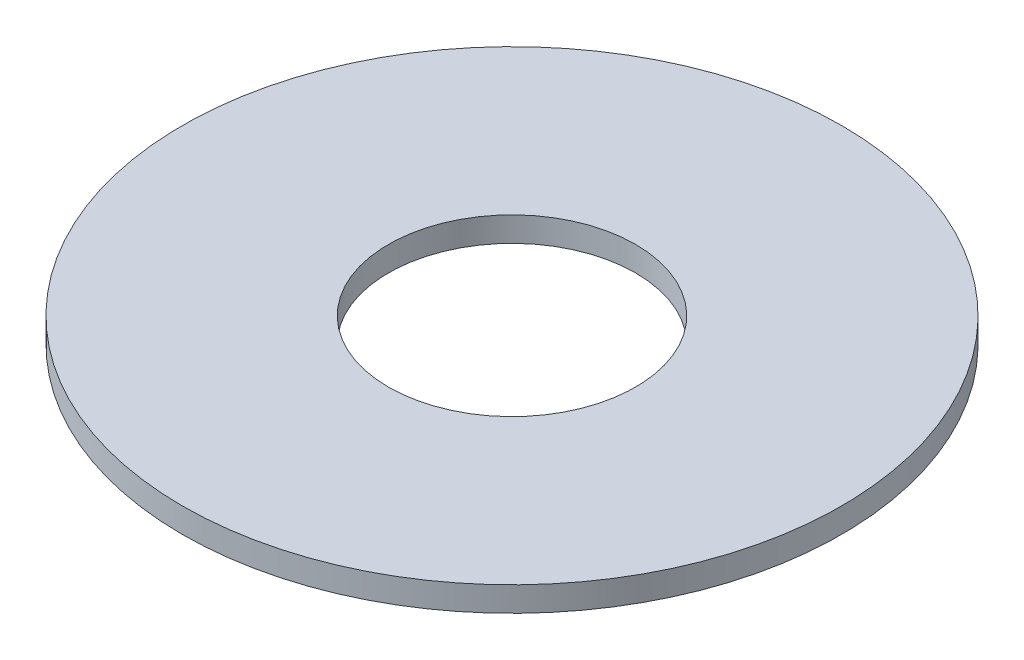
ISO-10303-21;
HEADER;
FILE_DESCRIPTION(('STEP AP214'),'2;1');
FILE_NAME('part.step','',(''),(''),'','','');
FILE_SCHEMA(('AUTOMOTIVE_DESIGN { 1 0 10303 214 1 1 1 1 }'));
ENDSEC;
DATA;
#1=APPLICATION_CONTEXT('core data for automotive mechanical design processes');
#2=APPLICATION_PROTOCOL_DEFINITION('international standard','automotive_design',2000,#1);
#3=PRODUCT_CONTEXT('',#1,'mechanical');
#4=PRODUCT('Part','Part','',(#3));
#5=PRODUCT_RELATED_PRODUCT_CATEGORY('part','',(#4));
#6=PRODUCT_DEFINITION_FORMATION('','',#4);
#7=PRODUCT_DEFINITION_CONTEXT('part definition',#1,'design');
#8=PRODUCT_DEFINITION('design','',#6,#7);
#9=PRODUCT_DEFINITION_SHAPE('','',#8);
#10=(LENGTH_UNIT() NAMED_UNIT(*) SI_UNIT(.MILLI.,.METRE.));
#11=(NAMED_UNIT(*) PLANE_ANGLE_UNIT() SI_UNIT($,.RADIAN.));
#12=(NAMED_UNIT(*) SI_UNIT($,.STERADIAN.) SOLID_ANGLE_UNIT());
#13=UNCERTAINTY_MEASURE_WITH_UNIT(LENGTH_MEASURE(1.E-05),#10,'distance_accuracy_value','');
#14=(GEOMETRIC_REPRESENTATION_CONTEXT(3) GLOBAL_UNCERTAINTY_ASSIGNED_CONTEXT((#13)) GLOBAL_UNIT_ASSIGNED_CONTEXT((#10,
#11,#12)) REPRESENTATION_CONTEXT('',''));
#15=CARTESIAN_POINT('',(0.,0.,0.));
#16=DIRECTION('',(0.,0.,1.));
#17=DIRECTION('',(1.,0.,0.));
#18=AXIS2_PLACEMENT_3D('',#15,#16,#17);
#19=CARTESIAN_POINT('',(0.,0.3,0.));
#20=DIRECTION('',(0.,1.,0.));
#21=DIRECTION('',(0.,0.,1.));
#22=AXIS2_PLACEMENT_3D('',#19,#20,#21);
#23=PLANE('',#22);
#24=CARTESIAN_POINT('',(0.,0.3,0.));
#25=DIRECTION('',(0.,1.,0.));
#26=DIRECTION('',(0.,0.,1.));
#27=AXIS2_PLACEMENT_3D('',#24,#25,#26);
#28=CIRCLE('',#27,4.);
#29=CARTESIAN_POINT('',(0.,0.3,4.));
#30=VERTEX_POINT('',#29);
#31=EDGE_CURVE('E10',#30,#30,#28,.T.);
#32=ORIENTED_EDGE('',*,*,#31,.T.);
#33=EDGE_LOOP('',(#32));
#34=FACE_BOUND('',#33,.T.);
#35=CARTESIAN_POINT('',(0.,0.3,0.));
#36=DIRECTION('',(0.,1.,0.));
#37=DIRECTION('',(0.,0.,1.));
#38=AXIS2_PLACEMENT_3D('',#35,#36,#37);
#39=CIRCLE('',#38,1.5);
#40=CARTESIAN_POINT('',(0.,0.3,1.5));
#41=VERTEX_POINT('',#40);
#42=EDGE_CURVE('E50',#41,#41,#39,.T.);
#43=ORIENTED_EDGE('',*,*,#42,.F.);
#44=EDGE_LOOP('',(#43));
#45=FACE_BOUND('',#44,.T.);
#46=ADVANCED_FACE('F39',(#34,#45),#23,.T.);
#47=CARTESIAN_POINT('',(0.,0.,0.));
#48=DIRECTION('',(0.,1.,0.));
#49=DIRECTION('',(0.,0.,1.));
#50=AXIS2_PLACEMENT_3D('',#47,#48,#49);
#51=PLANE('',#50);
#52=CARTESIAN_POINT('',(0.,0.,0.));
#53=DIRECTION('',(0.,1.,0.));
#54=DIRECTION('',(0.,0.,1.));
#55=AXIS2_PLACEMENT_3D('',#52,#53,#54);
#56=CIRCLE('',#55,4.);
#57=CARTESIAN_POINT('',(0.,0.,4.));
#58=VERTEX_POINT('',#57);
#59=EDGE_CURVE('E43',#58,#58,#56,.T.);
#60=ORIENTED_EDGE('',*,*,#59,.F.);
#61=EDGE_LOOP('',(#60));
#62=FACE_BOUND('',#61,.T.);
#63=CARTESIAN_POINT('',(0.,0.,0.));
#64=DIRECTION('',(0.,1.,0.));
#65=DIRECTION('',(0.,0.,1.));
#66=AXIS2_PLACEMENT_3D('',#63,#64,#65);
#67=CIRCLE('',#66,1.5);
#68=CARTESIAN_POINT('',(0.,0.,1.5));
#69=VERTEX_POINT('',#68);
#70=EDGE_CURVE('E52',#69,#69,#67,.T.);
#71=ORIENTED_EDGE('',*,*,#70,.T.);
#72=EDGE_LOOP('',(#71));
#73=FACE_BOUND('',#72,.T.);
#74=ADVANCED_FACE('F62',(#62,#73),#51,.F.);
#75=CARTESIAN_POINT('',(0.,0.3,0.));
#76=DIRECTION('',(0.,-1.,0.));
#77=DIRECTION('',(0.,0.,-1.));
#78=AXIS2_PLACEMENT_3D('',#75,#76,#77);
#79=CYLINDRICAL_SURFACE('',#78,4.);
#80=ORIENTED_EDGE('',*,*,#31,.F.);
#81=EDGE_LOOP('',(#80));
#82=FACE_BOUND('',#81,.T.);
#83=ORIENTED_EDGE('',*,*,#59,.T.);
#84=EDGE_LOOP('',(#83));
#85=FACE_BOUND('',#84,.T.);
#86=ADVANCED_FACE('F41',(#82,#85),#79,.T.);
#87=CARTESIAN_POINT('',(0.,0.3,0.));
#88=DIRECTION('',(0.,-1.,0.));
#89=DIRECTION('',(0.,0.,-1.));
#90=AXIS2_PLACEMENT_3D('',#87,#88,#89);
#91=CYLINDRICAL_SURFACE('',#90,1.5);
#92=ORIENTED_EDGE('',*,*,#42,.T.);
#93=EDGE_LOOP('',(#92));
#94=FACE_BOUND('',#93,.T.);
#95=ORIENTED_EDGE('',*,*,#70,.F.);
#96=EDGE_LOOP('',(#95));
#97=FACE_BOUND('',#96,.T.);
#98=ADVANCED_FACE('F58',(#94,#97),#91,.F.);
#99=CLOSED_SHELL('',(#46,#74,#86,#98));
#100=MANIFOLD_SOLID_BREP('B2',#99);
#101=ADVANCED_BREP_SHAPE_REPRESENTATION('',(#18,#100),#14);
#102=SHAPE_DEFINITION_REPRESENTATION(#9,#101);
ENDSEC;
END-ISO-10303-21;
